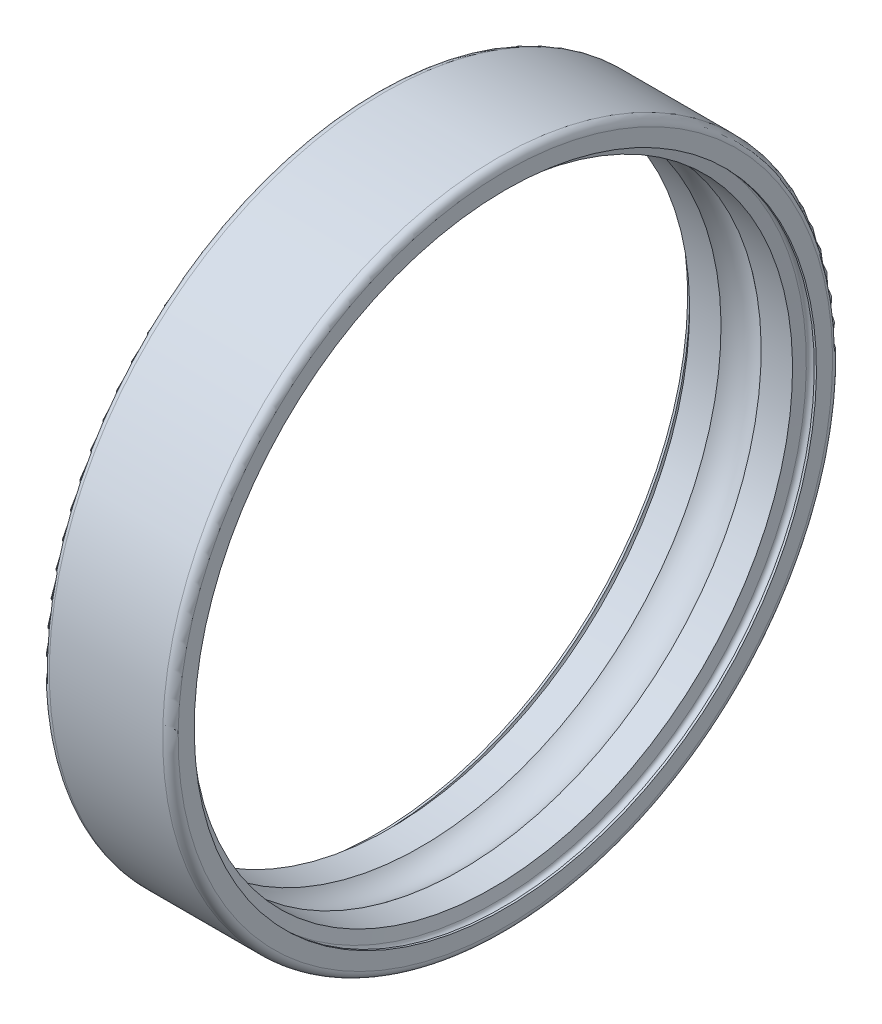
ISO-10303-21;
HEADER;
FILE_DESCRIPTION(('STEP AP214'),'2;1');
FILE_NAME('part.step','',(''),(''),'','','');
FILE_SCHEMA(('AUTOMOTIVE_DESIGN { 1 0 10303 214 1 1 1 1 }'));
ENDSEC;
DATA;
#1=APPLICATION_CONTEXT('core data for automotive mechanical design processes');
#2=APPLICATION_PROTOCOL_DEFINITION('international standard','automotive_design',2000,#1);
#3=PRODUCT_CONTEXT('',#1,'mechanical');
#4=PRODUCT('Part','Part','',(#3));
#5=PRODUCT_RELATED_PRODUCT_CATEGORY('part','',(#4));
#6=PRODUCT_DEFINITION_FORMATION('','',#4);
#7=PRODUCT_DEFINITION_CONTEXT('part definition',#1,'design');
#8=PRODUCT_DEFINITION('design','',#6,#7);
#9=PRODUCT_DEFINITION_SHAPE('','',#8);
#10=(LENGTH_UNIT() NAMED_UNIT(*) SI_UNIT(.MILLI.,.METRE.));
#11=(NAMED_UNIT(*) PLANE_ANGLE_UNIT() SI_UNIT($,.RADIAN.));
#12=(NAMED_UNIT(*) SI_UNIT($,.STERADIAN.) SOLID_ANGLE_UNIT());
#13=UNCERTAINTY_MEASURE_WITH_UNIT(LENGTH_MEASURE(1.E-05),#10,'distance_accuracy_value','');
#14=(GEOMETRIC_REPRESENTATION_CONTEXT(3) GLOBAL_UNCERTAINTY_ASSIGNED_CONTEXT((#13)) GLOBAL_UNIT_ASSIGNED_CONTEXT((#10,
#11,#12)) REPRESENTATION_CONTEXT('',''));
#15=CARTESIAN_POINT('',(0.,0.,0.));
#16=DIRECTION('',(0.,0.,1.));
#17=DIRECTION('',(1.,0.,0.));
#18=AXIS2_PLACEMENT_3D('',#15,#16,#17);
#19=CARTESIAN_POINT('',(4.745,0.,0.));
#20=DIRECTION('',(1.,0.,0.));
#21=DIRECTION('',(0.,0.,-1.));
#22=AXIS2_PLACEMENT_3D('',#19,#20,#21);
#23=TOROIDAL_SURFACE('',#22,12.075,0.17);
#24=CARTESIAN_POINT('',(4.915,0.,0.));
#25=DIRECTION('',(1.,0.,0.));
#26=DIRECTION('',(0.,1.,0.));
#27=AXIS2_PLACEMENT_3D('',#24,#25,#26);
#28=CIRCLE('',#27,12.075);
#29=CARTESIAN_POINT('',(4.915,12.075,0.));
#30=VERTEX_POINT('',#29);
#31=EDGE_CURVE('E10',#30,#30,#28,.T.);
#32=ORIENTED_EDGE('',*,*,#31,.T.);
#33=EDGE_LOOP('',(#32));
#34=FACE_BOUND('',#33,.T.);
#35=CARTESIAN_POINT('',(4.57758268198793,0.,0.));
#36=DIRECTION('',(1.,0.,0.));
#37=DIRECTION('',(0.,1.,0.));
#38=AXIS2_PLACEMENT_3D('',#35,#36,#37);
#39=CIRCLE('',#38,12.1045201902034);
#40=CARTESIAN_POINT('',(4.57758268198793,12.1045201902034,0.));
#41=VERTEX_POINT('',#40);
#42=EDGE_CURVE('E73',#41,#41,#39,.T.);
#43=ORIENTED_EDGE('',*,*,#42,.F.);
#44=EDGE_LOOP('',(#43));
#45=FACE_BOUND('',#44,.T.);
#46=ADVANCED_FACE('F15',(#34,#45),#23,.F.);
#47=CARTESIAN_POINT('',(4.9575,0.,0.));
#48=DIRECTION('',(-1.,0.,0.));
#49=DIRECTION('',(0.,1.,0.));
#50=AXIS2_PLACEMENT_3D('',#47,#48,#49);
#51=CYLINDRICAL_SURFACE('',#50,12.075);
#52=CARTESIAN_POINT('',(5.,0.,0.));
#53=DIRECTION('',(1.,0.,0.));
#54=DIRECTION('',(0.,1.,0.));
#55=AXIS2_PLACEMENT_3D('',#52,#53,#54);
#56=CIRCLE('',#55,12.075);
#57=CARTESIAN_POINT('',(5.,12.075,0.));
#58=VERTEX_POINT('',#57);
#59=EDGE_CURVE('E25',#58,#58,#56,.T.);
#60=ORIENTED_EDGE('',*,*,#59,.T.);
#61=EDGE_LOOP('',(#60));
#62=FACE_BOUND('',#61,.T.);
#63=ORIENTED_EDGE('',*,*,#31,.F.);
#64=EDGE_LOOP('',(#63));
#65=FACE_BOUND('',#64,.T.);
#66=ADVANCED_FACE('F123',(#62,#65),#51,.F.);
#67=CARTESIAN_POINT('',(5.,12.3875,0.));
#68=DIRECTION('',(1.,0.,0.));
#69=DIRECTION('',(0.,1.,0.));
#70=AXIS2_PLACEMENT_3D('',#67,#68,#69);
#71=PLANE('',#70);
#72=CARTESIAN_POINT('',(5.,0.,0.));
#73=DIRECTION('',(1.,0.,0.));
#74=DIRECTION('',(0.,1.,0.));
#75=AXIS2_PLACEMENT_3D('',#72,#73,#74);
#76=CIRCLE('',#75,12.7);
#77=CARTESIAN_POINT('',(5.,12.7,0.));
#78=VERTEX_POINT('',#77);
#79=EDGE_CURVE('E86',#78,#78,#76,.T.);
#80=ORIENTED_EDGE('',*,*,#79,.T.);
#81=EDGE_LOOP('',(#80));
#82=FACE_BOUND('',#81,.T.);
#83=ORIENTED_EDGE('',*,*,#59,.F.);
#84=EDGE_LOOP('',(#83));
#85=FACE_BOUND('',#84,.T.);
#86=ADVANCED_FACE('F17',(#82,#85),#71,.T.);
#87=CARTESIAN_POINT('',(4.7,0.,0.));
#88=DIRECTION('',(1.,0.,0.));
#89=DIRECTION('',(0.,0.,-1.));
#90=AXIS2_PLACEMENT_3D('',#87,#88,#89);
#91=TOROIDAL_SURFACE('',#90,12.7,0.3);
#92=CARTESIAN_POINT('',(4.7,0.,0.));
#93=DIRECTION('',(1.,0.,0.));
#94=DIRECTION('',(0.,1.,0.));
#95=AXIS2_PLACEMENT_3D('',#92,#93,#94);
#96=CIRCLE('',#95,13.);
#97=CARTESIAN_POINT('',(4.7,13.,0.));
#98=VERTEX_POINT('',#97);
#99=EDGE_CURVE('E87',#98,#98,#96,.T.);
#100=ORIENTED_EDGE('',*,*,#99,.T.);
#101=EDGE_LOOP('',(#100));
#102=FACE_BOUND('',#101,.T.);
#103=ORIENTED_EDGE('',*,*,#79,.F.);
#104=EDGE_LOOP('',(#103));
#105=FACE_BOUND('',#104,.T.);
#106=ADVANCED_FACE('F143',(#102,#105),#91,.T.);
#107=CARTESIAN_POINT('',(2.5,0.,0.));
#108=DIRECTION('',(-1.,0.,0.));
#109=DIRECTION('',(0.,1.,0.));
#110=AXIS2_PLACEMENT_3D('',#107,#108,#109);
#111=CYLINDRICAL_SURFACE('',#110,13.);
#112=CARTESIAN_POINT('',(0.3,0.,0.));
#113=DIRECTION('',(1.,0.,0.));
#114=DIRECTION('',(0.,1.,0.));
#115=AXIS2_PLACEMENT_3D('',#112,#113,#114);
#116=CIRCLE('',#115,13.);
#117=CARTESIAN_POINT('',(0.3,13.,0.));
#118=VERTEX_POINT('',#117);
#119=EDGE_CURVE('E88',#118,#118,#116,.T.);
#120=ORIENTED_EDGE('',*,*,#119,.T.);
#121=EDGE_LOOP('',(#120));
#122=FACE_BOUND('',#121,.T.);
#123=ORIENTED_EDGE('',*,*,#99,.F.);
#124=EDGE_LOOP('',(#123));
#125=FACE_BOUND('',#124,.T.);
#126=ADVANCED_FACE('F134',(#122,#125),#111,.T.);
#127=CARTESIAN_POINT('',(0.3,0.,0.));
#128=DIRECTION('',(1.,0.,0.));
#129=DIRECTION('',(0.,0.,-1.));
#130=AXIS2_PLACEMENT_3D('',#127,#128,#129);
#131=TOROIDAL_SURFACE('',#130,12.7,0.3);
#132=CARTESIAN_POINT('',(0.,0.,0.));
#133=DIRECTION('',(1.,0.,0.));
#134=DIRECTION('',(0.,1.,0.));
#135=AXIS2_PLACEMENT_3D('',#132,#133,#134);
#136=CIRCLE('',#135,12.7);
#137=CARTESIAN_POINT('',(0.,12.7,0.));
#138=VERTEX_POINT('',#137);
#139=EDGE_CURVE('E19',#138,#138,#136,.T.);
#140=ORIENTED_EDGE('',*,*,#139,.T.);
#141=EDGE_LOOP('',(#140));
#142=FACE_BOUND('',#141,.T.);
#143=ORIENTED_EDGE('',*,*,#119,.F.);
#144=EDGE_LOOP('',(#143));
#145=FACE_BOUND('',#144,.T.);
#146=ADVANCED_FACE('F130',(#142,#145),#131,.T.);
#147=CARTESIAN_POINT('',(0.,12.3875,0.));
#148=DIRECTION('',(-1.,0.,0.));
#149=DIRECTION('',(0.,-1.,0.));
#150=AXIS2_PLACEMENT_3D('',#147,#148,#149);
#151=PLANE('',#150);
#152=CARTESIAN_POINT('',(0.,0.,0.));
#153=DIRECTION('',(1.,0.,0.));
#154=DIRECTION('',(0.,1.,0.));
#155=AXIS2_PLACEMENT_3D('',#152,#153,#154);
#156=CIRCLE('',#155,12.075);
#157=CARTESIAN_POINT('',(0.,12.075,0.));
#158=VERTEX_POINT('',#157);
#159=EDGE_CURVE('E95',#158,#158,#156,.T.);
#160=ORIENTED_EDGE('',*,*,#159,.T.);
#161=EDGE_LOOP('',(#160));
#162=FACE_BOUND('',#161,.T.);
#163=ORIENTED_EDGE('',*,*,#139,.F.);
#164=EDGE_LOOP('',(#163));
#165=FACE_BOUND('',#164,.T.);
#166=ADVANCED_FACE('F133',(#162,#165),#151,.T.);
#167=CARTESIAN_POINT('',(0.0424999999999996,0.,0.));
#168=DIRECTION('',(-1.,0.,0.));
#169=DIRECTION('',(0.,1.,0.));
#170=AXIS2_PLACEMENT_3D('',#167,#168,#169);
#171=CYLINDRICAL_SURFACE('',#170,12.075);
#172=CARTESIAN_POINT('',(0.0849999999999991,0.,0.));
#173=DIRECTION('',(1.,0.,0.));
#174=DIRECTION('',(0.,1.,0.));
#175=AXIS2_PLACEMENT_3D('',#172,#173,#174);
#176=CIRCLE('',#175,12.075);
#177=CARTESIAN_POINT('',(0.085,12.075,0.));
#178=VERTEX_POINT('',#177);
#179=EDGE_CURVE('E56',#178,#178,#176,.T.);
#180=ORIENTED_EDGE('',*,*,#179,.T.);
#181=EDGE_LOOP('',(#180));
#182=FACE_BOUND('',#181,.T.);
#183=ORIENTED_EDGE('',*,*,#159,.F.);
#184=EDGE_LOOP('',(#183));
#185=FACE_BOUND('',#184,.T.);
#186=ADVANCED_FACE('F138',(#182,#185),#171,.F.);
#187=CARTESIAN_POINT('',(0.255,0.,0.));
#188=DIRECTION('',(1.,0.,0.));
#189=DIRECTION('',(0.,0.,-1.));
#190=AXIS2_PLACEMENT_3D('',#187,#188,#189);
#191=TOROIDAL_SURFACE('',#190,12.075,0.17);
#192=CARTESIAN_POINT('',(0.422417318012074,0.,0.));
#193=DIRECTION('',(1.,0.,0.));
#194=DIRECTION('',(0.,1.,0.));
#195=AXIS2_PLACEMENT_3D('',#192,#193,#194);
#196=CIRCLE('',#195,12.1045201902034);
#197=CARTESIAN_POINT('',(0.422417318012074,12.1045201902034,0.));
#198=VERTEX_POINT('',#197);
#199=EDGE_CURVE('E63',#198,#198,#196,.T.);
#200=ORIENTED_EDGE('',*,*,#199,.T.);
#201=EDGE_LOOP('',(#200));
#202=FACE_BOUND('',#201,.T.);
#203=ORIENTED_EDGE('',*,*,#179,.F.);
#204=EDGE_LOOP('',(#203));
#205=FACE_BOUND('',#204,.T.);
#206=ADVANCED_FACE('F119',(#202,#205),#191,.F.);
#207=CARTESIAN_POINT('',(0.462489404416873,0.,0.));
#208=DIRECTION('',(-1.,0.,0.));
#209=DIRECTION('',(0.,1.,0.));
#210=AXIS2_PLACEMENT_3D('',#207,#208,#209);
#211=CONICAL_SURFACE('',#210,11.8772600951017,1.39626340159546);
#212=CARTESIAN_POINT('',(0.502561490821673,0.,0.));
#213=DIRECTION('',(1.,0.,0.));
#214=DIRECTION('',(0.,1.,0.));
#215=AXIS2_PLACEMENT_3D('',#212,#213,#214);
#216=CIRCLE('',#215,11.65);
#217=CARTESIAN_POINT('',(0.502561490821673,11.65,0.));
#218=VERTEX_POINT('',#217);
#219=EDGE_CURVE('E97',#218,#218,#216,.T.);
#220=ORIENTED_EDGE('',*,*,#219,.T.);
#221=EDGE_LOOP('',(#220));
#222=FACE_BOUND('',#221,.T.);
#223=ORIENTED_EDGE('',*,*,#199,.F.);
#224=EDGE_LOOP('',(#223));
#225=FACE_BOUND('',#224,.T.);
#226=ADVANCED_FACE('F103',(#222,#225),#211,.F.);
#227=CARTESIAN_POINT('',(1.11163659685988,0.,0.));
#228=DIRECTION('',(-1.,0.,0.));
#229=DIRECTION('',(0.,1.,0.));
#230=AXIS2_PLACEMENT_3D('',#227,#228,#229);
#231=CYLINDRICAL_SURFACE('',#230,11.65);
#232=CARTESIAN_POINT('',(1.72071170289809,0.,0.));
#233=DIRECTION('',(1.,0.,0.));
#234=DIRECTION('',(0.,1.,0.));
#235=AXIS2_PLACEMENT_3D('',#232,#233,#234);
#236=CIRCLE('',#235,11.65);
#237=CARTESIAN_POINT('',(1.72071170289809,11.65,0.));
#238=VERTEX_POINT('',#237);
#239=EDGE_CURVE('E80',#238,#238,#236,.T.);
#240=ORIENTED_EDGE('',*,*,#239,.T.);
#241=EDGE_LOOP('',(#240));
#242=FACE_BOUND('',#241,.T.);
#243=ORIENTED_EDGE('',*,*,#219,.F.);
#244=EDGE_LOOP('',(#243));
#245=FACE_BOUND('',#244,.T.);
#246=ADVANCED_FACE('F106',(#242,#245),#231,.F.);
#247=CARTESIAN_POINT('',(2.5,0.,0.));
#248=DIRECTION('',(1.,0.,0.));
#249=DIRECTION('',(0.,0.,-1.));
#250=AXIS2_PLACEMENT_3D('',#247,#248,#249);
#251=TOROIDAL_SURFACE('',#250,10.75,1.1905);
#252=CARTESIAN_POINT('',(3.27928829710191,0.,0.));
#253=DIRECTION('',(1.,0.,0.));
#254=DIRECTION('',(0.,1.,0.));
#255=AXIS2_PLACEMENT_3D('',#252,#253,#254);
#256=CIRCLE('',#255,11.65);
#257=CARTESIAN_POINT('',(3.27928829710191,11.65,0.));
#258=VERTEX_POINT('',#257);
#259=EDGE_CURVE('E77',#258,#258,#256,.T.);
#260=ORIENTED_EDGE('',*,*,#259,.T.);
#261=EDGE_LOOP('',(#260));
#262=FACE_BOUND('',#261,.T.);
#263=ORIENTED_EDGE('',*,*,#239,.F.);
#264=EDGE_LOOP('',(#263));
#265=FACE_BOUND('',#264,.T.);
#266=ADVANCED_FACE('F108',(#262,#265),#251,.F.);
#267=CARTESIAN_POINT('',(3.88836340314012,0.,0.));
#268=DIRECTION('',(-1.,0.,0.));
#269=DIRECTION('',(0.,1.,0.));
#270=AXIS2_PLACEMENT_3D('',#267,#268,#269);
#271=CYLINDRICAL_SURFACE('',#270,11.65);
#272=CARTESIAN_POINT('',(4.49743850917833,0.,0.));
#273=DIRECTION('',(1.,0.,0.));
#274=DIRECTION('',(0.,1.,0.));
#275=AXIS2_PLACEMENT_3D('',#272,#273,#274);
#276=CIRCLE('',#275,11.65);
#277=CARTESIAN_POINT('',(4.49743850917833,11.65,0.));
#278=VERTEX_POINT('',#277);
#279=EDGE_CURVE('E78',#278,#278,#276,.T.);
#280=ORIENTED_EDGE('',*,*,#279,.T.);
#281=EDGE_LOOP('',(#280));
#282=FACE_BOUND('',#281,.T.);
#283=ORIENTED_EDGE('',*,*,#259,.F.);
#284=EDGE_LOOP('',(#283));
#285=FACE_BOUND('',#284,.T.);
#286=ADVANCED_FACE('F116',(#282,#285),#271,.F.);
#287=CARTESIAN_POINT('',(4.53751059558313,0.,0.));
#288=DIRECTION('',(1.,0.,0.));
#289=DIRECTION('',(0.,1.,0.));
#290=AXIS2_PLACEMENT_3D('',#287,#288,#289);
#291=CONICAL_SURFACE('',#290,11.8772600951017,1.39626340159546);
#292=ORIENTED_EDGE('',*,*,#42,.T.);
#293=EDGE_LOOP('',(#292));
#294=FACE_BOUND('',#293,.T.);
#295=ORIENTED_EDGE('',*,*,#279,.F.);
#296=EDGE_LOOP('',(#295));
#297=FACE_BOUND('',#296,.T.);
#298=ADVANCED_FACE('F74',(#294,#297),#291,.F.);
#299=CLOSED_SHELL('',(#46,#66,#86,#106,#126,#146,#166,#186,#206,#226,#246,#266,#286,#298));
#300=MANIFOLD_SOLID_BREP('B1',#299);
#301=ADVANCED_BREP_SHAPE_REPRESENTATION('',(#18,#300),#14);
#302=SHAPE_DEFINITION_REPRESENTATION(#9,#301);
ENDSEC;
END-ISO-10303-21;
